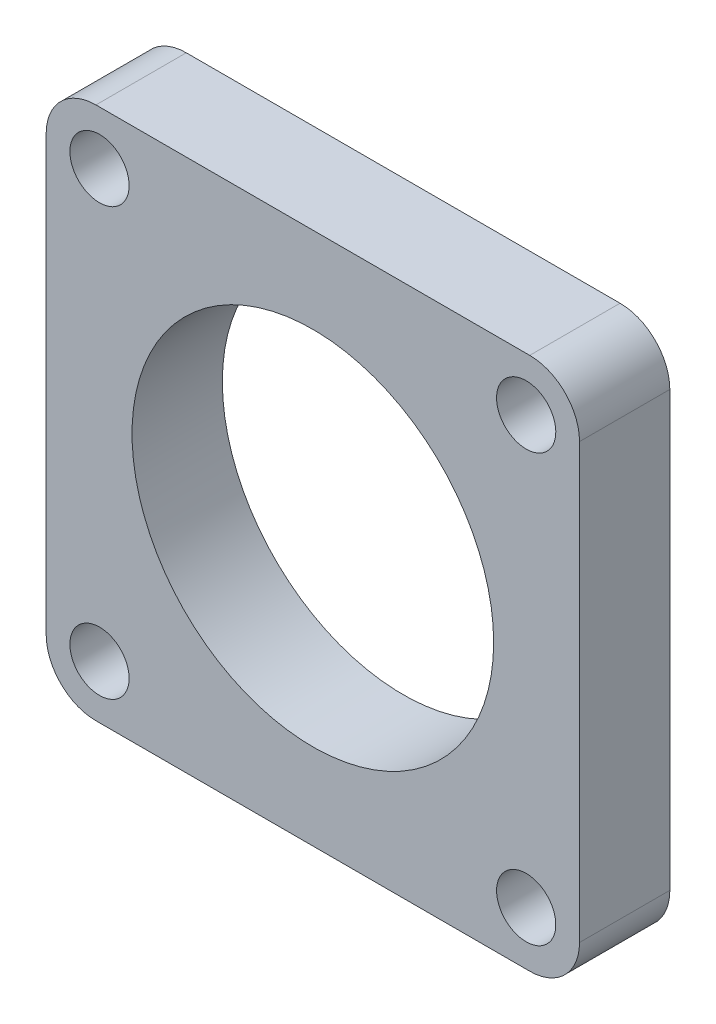
ISO-10303-21;
HEADER;
FILE_DESCRIPTION(('STEP AP214'),'2;1');
FILE_NAME('part.step','',(''),(''),'','','');
FILE_SCHEMA(('AUTOMOTIVE_DESIGN { 1 0 10303 214 1 1 1 1 }'));
ENDSEC;
DATA;
#1=APPLICATION_CONTEXT('core data for automotive mechanical design processes');
#2=APPLICATION_PROTOCOL_DEFINITION('international standard','automotive_design',2000,#1);
#3=PRODUCT_CONTEXT('',#1,'mechanical');
#4=PRODUCT('Part','Part','',(#3));
#5=PRODUCT_RELATED_PRODUCT_CATEGORY('part','',(#4));
#6=PRODUCT_DEFINITION_FORMATION('','',#4);
#7=PRODUCT_DEFINITION_CONTEXT('part definition',#1,'design');
#8=PRODUCT_DEFINITION('design','',#6,#7);
#9=PRODUCT_DEFINITION_SHAPE('','',#8);
#10=(LENGTH_UNIT() NAMED_UNIT(*) SI_UNIT(.MILLI.,.METRE.));
#11=(NAMED_UNIT(*) PLANE_ANGLE_UNIT() SI_UNIT($,.RADIAN.));
#12=(NAMED_UNIT(*) SI_UNIT($,.STERADIAN.) SOLID_ANGLE_UNIT());
#13=UNCERTAINTY_MEASURE_WITH_UNIT(LENGTH_MEASURE(1.E-05),#10,'distance_accuracy_value','');
#14=(GEOMETRIC_REPRESENTATION_CONTEXT(3) GLOBAL_UNCERTAINTY_ASSIGNED_CONTEXT((#13)) GLOBAL_UNIT_ASSIGNED_CONTEXT((#10,
#11,#12)) REPRESENTATION_CONTEXT('',''));
#15=CARTESIAN_POINT('',(0.,0.,0.));
#16=DIRECTION('',(0.,0.,1.));
#17=DIRECTION('',(1.,0.,0.));
#18=AXIS2_PLACEMENT_3D('',#15,#16,#17);
#19=CARTESIAN_POINT('',(37.5,-37.5,12.7));
#20=DIRECTION('',(-1.,0.,0.));
#21=DIRECTION('',(0.,0.,1.));
#22=AXIS2_PLACEMENT_3D('',#19,#20,#21);
#23=PLANE('',#22);
#24=DIRECTION('',(0.,1.,0.));
#25=VECTOR('',#24,1.);
#26=CARTESIAN_POINT('',(37.5,-37.5,12.7));
#27=LINE('',#26,#25);
#28=CARTESIAN_POINT('',(37.5,-30.5,12.7));
#29=VERTEX_POINT('',#28);
#30=CARTESIAN_POINT('',(37.5,30.5,12.7));
#31=VERTEX_POINT('',#30);
#32=EDGE_CURVE('E151',#29,#31,#27,.T.);
#33=ORIENTED_EDGE('',*,*,#32,.F.);
#34=DIRECTION('',(0.,0.,-1.));
#35=VECTOR('',#34,1.);
#36=CARTESIAN_POINT('',(37.5,-30.5,12.7));
#37=LINE('',#36,#35);
#38=CARTESIAN_POINT('',(37.5,-30.5,0.));
#39=VERTEX_POINT('',#38);
#40=EDGE_CURVE('E190',#29,#39,#37,.T.);
#41=ORIENTED_EDGE('',*,*,#40,.T.);
#42=DIRECTION('',(0.,1.,0.));
#43=VECTOR('',#42,1.);
#44=CARTESIAN_POINT('',(37.5,-37.5,0.));
#45=LINE('',#44,#43);
#46=CARTESIAN_POINT('',(37.5,30.5,0.));
#47=VERTEX_POINT('',#46);
#48=EDGE_CURVE('E201',#39,#47,#45,.T.);
#49=ORIENTED_EDGE('',*,*,#48,.T.);
#50=DIRECTION('',(0.,0.,-1.));
#51=VECTOR('',#50,1.);
#52=CARTESIAN_POINT('',(37.5,30.5,12.7));
#53=LINE('',#52,#51);
#54=EDGE_CURVE('E187',#47,#31,#53,.F.);
#55=ORIENTED_EDGE('',*,*,#54,.T.);
#56=EDGE_LOOP('',(#33,#41,#49,#55));
#57=FACE_BOUND('',#56,.T.);
#58=ADVANCED_FACE('F40',(#57),#23,.F.);
#59=CARTESIAN_POINT('',(-37.5,37.5,12.7));
#60=DIRECTION('',(0.,-1.,0.));
#61=DIRECTION('',(0.,0.,-1.));
#62=AXIS2_PLACEMENT_3D('',#59,#60,#61);
#63=PLANE('',#62);
#64=DIRECTION('',(-1.,0.,0.));
#65=VECTOR('',#64,1.);
#66=CARTESIAN_POINT('',(-37.5,37.5,0.));
#67=LINE('',#66,#65);
#68=CARTESIAN_POINT('',(30.5,37.5,0.));
#69=VERTEX_POINT('',#68);
#70=CARTESIAN_POINT('',(-30.5,37.5,0.));
#71=VERTEX_POINT('',#70);
#72=EDGE_CURVE('E159',#69,#71,#67,.T.);
#73=ORIENTED_EDGE('',*,*,#72,.T.);
#74=DIRECTION('',(0.,0.,-1.));
#75=VECTOR('',#74,1.);
#76=CARTESIAN_POINT('',(-30.5,37.5,12.7));
#77=LINE('',#76,#75);
#78=CARTESIAN_POINT('',(-30.5,37.5,12.7));
#79=VERTEX_POINT('',#78);
#80=EDGE_CURVE('E11',#71,#79,#77,.F.);
#81=ORIENTED_EDGE('',*,*,#80,.T.);
#82=DIRECTION('',(-1.,0.,0.));
#83=VECTOR('',#82,1.);
#84=CARTESIAN_POINT('',(-37.5,37.5,12.7));
#85=LINE('',#84,#83);
#86=CARTESIAN_POINT('',(30.5,37.5,12.7));
#87=VERTEX_POINT('',#86);
#88=EDGE_CURVE('E156',#87,#79,#85,.T.);
#89=ORIENTED_EDGE('',*,*,#88,.F.);
#90=DIRECTION('',(0.,0.,-1.));
#91=VECTOR('',#90,1.);
#92=CARTESIAN_POINT('',(30.5,37.5,12.7));
#93=LINE('',#92,#91);
#94=EDGE_CURVE('E49',#87,#69,#93,.T.);
#95=ORIENTED_EDGE('',*,*,#94,.T.);
#96=EDGE_LOOP('',(#73,#81,#89,#95));
#97=FACE_BOUND('',#96,.T.);
#98=ADVANCED_FACE('F197',(#97),#63,.F.);
#99=CARTESIAN_POINT('',(-37.5,-37.5,12.7));
#100=DIRECTION('',(1.,0.,0.));
#101=DIRECTION('',(0.,0.,-1.));
#102=AXIS2_PLACEMENT_3D('',#99,#100,#101);
#103=PLANE('',#102);
#104=DIRECTION('',(0.,-1.,0.));
#105=VECTOR('',#104,1.);
#106=CARTESIAN_POINT('',(-37.5,-37.5,0.));
#107=LINE('',#106,#105);
#108=CARTESIAN_POINT('',(-37.5,30.5,0.));
#109=VERTEX_POINT('',#108);
#110=CARTESIAN_POINT('',(-37.5,-30.5,0.));
#111=VERTEX_POINT('',#110);
#112=EDGE_CURVE('E152',#109,#111,#107,.T.);
#113=ORIENTED_EDGE('',*,*,#112,.T.);
#114=DIRECTION('',(0.,0.,-1.));
#115=VECTOR('',#114,1.);
#116=CARTESIAN_POINT('',(-37.5,-30.5,12.7));
#117=LINE('',#116,#115);
#118=CARTESIAN_POINT('',(-37.5,-30.5,12.7));
#119=VERTEX_POINT('',#118);
#120=EDGE_CURVE('E127',#111,#119,#117,.F.);
#121=ORIENTED_EDGE('',*,*,#120,.T.);
#122=DIRECTION('',(0.,-1.,0.));
#123=VECTOR('',#122,1.);
#124=CARTESIAN_POINT('',(-37.5,-37.5,12.7));
#125=LINE('',#124,#123);
#126=CARTESIAN_POINT('',(-37.5,30.5,12.7));
#127=VERTEX_POINT('',#126);
#128=EDGE_CURVE('E210',#127,#119,#125,.T.);
#129=ORIENTED_EDGE('',*,*,#128,.F.);
#130=DIRECTION('',(0.,0.,-1.));
#131=VECTOR('',#130,1.);
#132=CARTESIAN_POINT('',(-37.5,30.5,12.7));
#133=LINE('',#132,#131);
#134=EDGE_CURVE('E133',#127,#109,#133,.T.);
#135=ORIENTED_EDGE('',*,*,#134,.T.);
#136=EDGE_LOOP('',(#113,#121,#129,#135));
#137=FACE_BOUND('',#136,.T.);
#138=ADVANCED_FACE('F271',(#137),#103,.F.);
#139=CARTESIAN_POINT('',(-37.5,-37.5,12.7));
#140=DIRECTION('',(0.,1.,0.));
#141=DIRECTION('',(0.,0.,1.));
#142=AXIS2_PLACEMENT_3D('',#139,#140,#141);
#143=PLANE('',#142);
#144=DIRECTION('',(1.,0.,0.));
#145=VECTOR('',#144,1.);
#146=CARTESIAN_POINT('',(-37.5,-37.5,12.7));
#147=LINE('',#146,#145);
#148=CARTESIAN_POINT('',(-30.5,-37.5,12.7));
#149=VERTEX_POINT('',#148);
#150=CARTESIAN_POINT('',(30.5,-37.5,12.7));
#151=VERTEX_POINT('',#150);
#152=EDGE_CURVE('E143',#149,#151,#147,.T.);
#153=ORIENTED_EDGE('',*,*,#152,.F.);
#154=DIRECTION('',(0.,0.,-1.));
#155=VECTOR('',#154,1.);
#156=CARTESIAN_POINT('',(-30.5,-37.5,12.7));
#157=LINE('',#156,#155);
#158=CARTESIAN_POINT('',(-30.5,-37.5,0.));
#159=VERTEX_POINT('',#158);
#160=EDGE_CURVE('E126',#149,#159,#157,.T.);
#161=ORIENTED_EDGE('',*,*,#160,.T.);
#162=DIRECTION('',(1.,0.,0.));
#163=VECTOR('',#162,1.);
#164=CARTESIAN_POINT('',(-37.5,-37.5,0.));
#165=LINE('',#164,#163);
#166=CARTESIAN_POINT('',(30.5,-37.5,0.));
#167=VERTEX_POINT('',#166);
#168=EDGE_CURVE('E140',#159,#167,#165,.T.);
#169=ORIENTED_EDGE('',*,*,#168,.T.);
#170=DIRECTION('',(0.,0.,-1.));
#171=VECTOR('',#170,1.);
#172=CARTESIAN_POINT('',(30.5,-37.5,12.7));
#173=LINE('',#172,#171);
#174=EDGE_CURVE('E146',#167,#151,#173,.F.);
#175=ORIENTED_EDGE('',*,*,#174,.T.);
#176=EDGE_LOOP('',(#153,#161,#169,#175));
#177=FACE_BOUND('',#176,.T.);
#178=ADVANCED_FACE('F139',(#177),#143,.F.);
#179=CARTESIAN_POINT('',(0.,0.,12.7));
#180=DIRECTION('',(0.,0.,-1.));
#181=DIRECTION('',(-1.,0.,0.));
#182=AXIS2_PLACEMENT_3D('',#179,#180,#181);
#183=PLANE('',#182);
#184=CARTESIAN_POINT('',(30.0000000000001,29.9999999999999,12.7));
#185=DIRECTION('',(0.,0.,1.));
#186=DIRECTION('',(0.,-1.,0.));
#187=AXIS2_PLACEMENT_3D('',#184,#185,#186);
#188=CIRCLE('',#187,4.165);
#189=CARTESIAN_POINT('',(30.0000000000001,25.8349999999999,12.7));
#190=VERTEX_POINT('',#189);
#191=EDGE_CURVE('E227',#190,#190,#188,.T.);
#192=ORIENTED_EDGE('',*,*,#191,.F.);
#193=EDGE_LOOP('',(#192));
#194=FACE_BOUND('',#193,.T.);
#195=CARTESIAN_POINT('',(30.,-30.,12.7));
#196=DIRECTION('',(0.,0.,1.));
#197=DIRECTION('',(-1.,0.,0.));
#198=AXIS2_PLACEMENT_3D('',#195,#196,#197);
#199=CIRCLE('',#198,4.165);
#200=CARTESIAN_POINT('',(25.835,-30.,12.7));
#201=VERTEX_POINT('',#200);
#202=EDGE_CURVE('E243',#201,#201,#199,.T.);
#203=ORIENTED_EDGE('',*,*,#202,.F.);
#204=EDGE_LOOP('',(#203));
#205=FACE_BOUND('',#204,.T.);
#206=CARTESIAN_POINT('',(-30.0000000000003,-29.9999999999997,12.7));
#207=DIRECTION('',(0.,0.,1.));
#208=DIRECTION('',(0.,1.,0.));
#209=AXIS2_PLACEMENT_3D('',#206,#207,#208);
#210=CIRCLE('',#209,4.165);
#211=CARTESIAN_POINT('',(-30.0000000000003,-25.8349999999997,12.7));
#212=VERTEX_POINT('',#211);
#213=EDGE_CURVE('E235',#212,#212,#210,.T.);
#214=ORIENTED_EDGE('',*,*,#213,.F.);
#215=EDGE_LOOP('',(#214));
#216=FACE_BOUND('',#215,.T.);
#217=CARTESIAN_POINT('',(-30.,30.,12.7));
#218=DIRECTION('',(0.,0.,1.));
#219=DIRECTION('',(1.,0.,0.));
#220=AXIS2_PLACEMENT_3D('',#217,#218,#219);
#221=CIRCLE('',#220,4.165);
#222=CARTESIAN_POINT('',(-25.835,30.,12.7));
#223=VERTEX_POINT('',#222);
#224=EDGE_CURVE('E219',#223,#223,#221,.T.);
#225=ORIENTED_EDGE('',*,*,#224,.F.);
#226=EDGE_LOOP('',(#225));
#227=FACE_BOUND('',#226,.T.);
#228=CARTESIAN_POINT('',(0.,0.,12.7));
#229=DIRECTION('',(0.,0.,1.));
#230=DIRECTION('',(1.,0.,0.));
#231=AXIS2_PLACEMENT_3D('',#228,#229,#230);
#232=CIRCLE('',#231,25.4254);
#233=CARTESIAN_POINT('',(25.4254,0.,12.7));
#234=VERTEX_POINT('',#233);
#235=EDGE_CURVE('E205',#234,#234,#232,.T.);
#236=ORIENTED_EDGE('',*,*,#235,.F.);
#237=EDGE_LOOP('',(#236));
#238=FACE_BOUND('',#237,.T.);
#239=ORIENTED_EDGE('',*,*,#128,.T.);
#240=CARTESIAN_POINT('',(-30.5,-30.5,12.7));
#241=DIRECTION('',(0.,0.,-1.));
#242=DIRECTION('',(-1.,0.,0.));
#243=AXIS2_PLACEMENT_3D('',#240,#241,#242);
#244=CIRCLE('',#243,7.);
#245=EDGE_CURVE('E184',#119,#149,#244,.F.);
#246=ORIENTED_EDGE('',*,*,#245,.T.);
#247=ORIENTED_EDGE('',*,*,#152,.T.);
#248=CARTESIAN_POINT('',(30.5,-30.5,12.7));
#249=DIRECTION('',(0.,0.,-1.));
#250=DIRECTION('',(-1.,0.,0.));
#251=AXIS2_PLACEMENT_3D('',#248,#249,#250);
#252=CIRCLE('',#251,7.);
#253=EDGE_CURVE('E181',#151,#29,#252,.F.);
#254=ORIENTED_EDGE('',*,*,#253,.T.);
#255=ORIENTED_EDGE('',*,*,#32,.T.);
#256=CARTESIAN_POINT('',(30.5,30.5,12.7));
#257=DIRECTION('',(0.,0.,-1.));
#258=DIRECTION('',(-1.,0.,0.));
#259=AXIS2_PLACEMENT_3D('',#256,#257,#258);
#260=CIRCLE('',#259,7.);
#261=EDGE_CURVE('E66',#31,#87,#260,.F.);
#262=ORIENTED_EDGE('',*,*,#261,.T.);
#263=ORIENTED_EDGE('',*,*,#88,.T.);
#264=CARTESIAN_POINT('',(-30.5,30.5,12.7));
#265=DIRECTION('',(0.,0.,-1.));
#266=DIRECTION('',(-1.,0.,0.));
#267=AXIS2_PLACEMENT_3D('',#264,#265,#266);
#268=CIRCLE('',#267,7.);
#269=EDGE_CURVE('E179',#79,#127,#268,.F.);
#270=ORIENTED_EDGE('',*,*,#269,.T.);
#271=EDGE_LOOP('',(#239,#246,#247,#254,#255,#262,#263,#270));
#272=FACE_BOUND('',#271,.T.);
#273=ADVANCED_FACE('F256',(#194,#205,#216,#227,#238,#272),#183,.F.);
#274=CARTESIAN_POINT('',(0.,0.,0.));
#275=DIRECTION('',(0.,0.,-1.));
#276=DIRECTION('',(-1.,0.,0.));
#277=AXIS2_PLACEMENT_3D('',#274,#275,#276);
#278=PLANE('',#277);
#279=CARTESIAN_POINT('',(30.0000000000001,29.9999999999999,0.));
#280=DIRECTION('',(0.,0.,-1.));
#281=DIRECTION('',(-1.,0.,0.));
#282=AXIS2_PLACEMENT_3D('',#279,#280,#281);
#283=CIRCLE('',#282,4.165);
#284=CARTESIAN_POINT('',(25.8350000000001,29.9999999999999,0.));
#285=VERTEX_POINT('',#284);
#286=EDGE_CURVE('E247',#285,#285,#283,.F.);
#287=ORIENTED_EDGE('',*,*,#286,.T.);
#288=EDGE_LOOP('',(#287));
#289=FACE_BOUND('',#288,.T.);
#290=CARTESIAN_POINT('',(30.,-30.,0.));
#291=DIRECTION('',(0.,0.,-1.));
#292=DIRECTION('',(-1.,0.,0.));
#293=AXIS2_PLACEMENT_3D('',#290,#291,#292);
#294=CIRCLE('',#293,4.165);
#295=CARTESIAN_POINT('',(25.835,-30.,0.));
#296=VERTEX_POINT('',#295);
#297=EDGE_CURVE('E239',#296,#296,#294,.F.);
#298=ORIENTED_EDGE('',*,*,#297,.T.);
#299=EDGE_LOOP('',(#298));
#300=FACE_BOUND('',#299,.T.);
#301=CARTESIAN_POINT('',(-30.0000000000003,-29.9999999999997,0.));
#302=DIRECTION('',(0.,0.,-1.));
#303=DIRECTION('',(-1.,0.,0.));
#304=AXIS2_PLACEMENT_3D('',#301,#302,#303);
#305=CIRCLE('',#304,4.165);
#306=CARTESIAN_POINT('',(-34.1650000000003,-29.9999999999997,0.));
#307=VERTEX_POINT('',#306);
#308=EDGE_CURVE('E231',#307,#307,#305,.F.);
#309=ORIENTED_EDGE('',*,*,#308,.T.);
#310=EDGE_LOOP('',(#309));
#311=FACE_BOUND('',#310,.T.);
#312=CARTESIAN_POINT('',(-30.,30.,0.));
#313=DIRECTION('',(0.,0.,-1.));
#314=DIRECTION('',(-1.,0.,0.));
#315=AXIS2_PLACEMENT_3D('',#312,#313,#314);
#316=CIRCLE('',#315,4.165);
#317=CARTESIAN_POINT('',(-34.165,30.,0.));
#318=VERTEX_POINT('',#317);
#319=EDGE_CURVE('E223',#318,#318,#316,.F.);
#320=ORIENTED_EDGE('',*,*,#319,.T.);
#321=EDGE_LOOP('',(#320));
#322=FACE_BOUND('',#321,.T.);
#323=CARTESIAN_POINT('',(0.,0.,0.));
#324=DIRECTION('',(0.,0.,-1.));
#325=DIRECTION('',(-1.,0.,0.));
#326=AXIS2_PLACEMENT_3D('',#323,#324,#325);
#327=CIRCLE('',#326,25.4254);
#328=CARTESIAN_POINT('',(-25.4254,0.,0.));
#329=VERTEX_POINT('',#328);
#330=EDGE_CURVE('E215',#329,#329,#327,.F.);
#331=ORIENTED_EDGE('',*,*,#330,.T.);
#332=EDGE_LOOP('',(#331));
#333=FACE_BOUND('',#332,.T.);
#334=ORIENTED_EDGE('',*,*,#168,.F.);
#335=CARTESIAN_POINT('',(-30.5,-30.5,0.));
#336=DIRECTION('',(0.,0.,-1.));
#337=DIRECTION('',(-1.,0.,0.));
#338=AXIS2_PLACEMENT_3D('',#335,#336,#337);
#339=CIRCLE('',#338,7.);
#340=EDGE_CURVE('E122',#159,#111,#339,.T.);
#341=ORIENTED_EDGE('',*,*,#340,.T.);
#342=ORIENTED_EDGE('',*,*,#112,.F.);
#343=CARTESIAN_POINT('',(-30.5,30.5,0.));
#344=DIRECTION('',(0.,0.,-1.));
#345=DIRECTION('',(-1.,0.,0.));
#346=AXIS2_PLACEMENT_3D('',#343,#344,#345);
#347=CIRCLE('',#346,7.);
#348=EDGE_CURVE('E167',#109,#71,#347,.T.);
#349=ORIENTED_EDGE('',*,*,#348,.T.);
#350=ORIENTED_EDGE('',*,*,#72,.F.);
#351=CARTESIAN_POINT('',(30.5,30.5,0.));
#352=DIRECTION('',(0.,0.,-1.));
#353=DIRECTION('',(-1.,0.,0.));
#354=AXIS2_PLACEMENT_3D('',#351,#352,#353);
#355=CIRCLE('',#354,7.);
#356=EDGE_CURVE('E145',#69,#47,#355,.T.);
#357=ORIENTED_EDGE('',*,*,#356,.T.);
#358=ORIENTED_EDGE('',*,*,#48,.F.);
#359=CARTESIAN_POINT('',(30.5,-30.5,0.));
#360=DIRECTION('',(0.,0.,-1.));
#361=DIRECTION('',(-1.,0.,0.));
#362=AXIS2_PLACEMENT_3D('',#359,#360,#361);
#363=CIRCLE('',#362,7.);
#364=EDGE_CURVE('E134',#39,#167,#363,.T.);
#365=ORIENTED_EDGE('',*,*,#364,.T.);
#366=EDGE_LOOP('',(#334,#341,#342,#349,#350,#357,#358,#365));
#367=FACE_BOUND('',#366,.T.);
#368=ADVANCED_FACE('F148',(#289,#300,#311,#322,#333,#367),#278,.T.);
#369=CARTESIAN_POINT('',(-30.5,-30.5,12.7));
#370=DIRECTION('',(0.,0.,-1.));
#371=DIRECTION('',(-1.,0.,0.));
#372=AXIS2_PLACEMENT_3D('',#369,#370,#371);
#373=CYLINDRICAL_SURFACE('',#372,7.);
#374=ORIENTED_EDGE('',*,*,#245,.F.);
#375=ORIENTED_EDGE('',*,*,#120,.F.);
#376=ORIENTED_EDGE('',*,*,#340,.F.);
#377=ORIENTED_EDGE('',*,*,#160,.F.);
#378=EDGE_LOOP('',(#374,#375,#376,#377));
#379=FACE_BOUND('',#378,.T.);
#380=ADVANCED_FACE('F125',(#379),#373,.T.);
#381=CARTESIAN_POINT('',(30.5,-30.5,12.7));
#382=DIRECTION('',(0.,0.,-1.));
#383=DIRECTION('',(-1.,0.,0.));
#384=AXIS2_PLACEMENT_3D('',#381,#382,#383);
#385=CYLINDRICAL_SURFACE('',#384,7.);
#386=ORIENTED_EDGE('',*,*,#253,.F.);
#387=ORIENTED_EDGE('',*,*,#174,.F.);
#388=ORIENTED_EDGE('',*,*,#364,.F.);
#389=ORIENTED_EDGE('',*,*,#40,.F.);
#390=EDGE_LOOP('',(#386,#387,#388,#389));
#391=FACE_BOUND('',#390,.T.);
#392=ADVANCED_FACE('F275',(#391),#385,.T.);
#393=CARTESIAN_POINT('',(-30.5,30.5,12.7));
#394=DIRECTION('',(0.,0.,-1.));
#395=DIRECTION('',(-1.,0.,0.));
#396=AXIS2_PLACEMENT_3D('',#393,#394,#395);
#397=CYLINDRICAL_SURFACE('',#396,7.);
#398=ORIENTED_EDGE('',*,*,#269,.F.);
#399=ORIENTED_EDGE('',*,*,#80,.F.);
#400=ORIENTED_EDGE('',*,*,#348,.F.);
#401=ORIENTED_EDGE('',*,*,#134,.F.);
#402=EDGE_LOOP('',(#398,#399,#400,#401));
#403=FACE_BOUND('',#402,.T.);
#404=ADVANCED_FACE('F273',(#403),#397,.T.);
#405=CARTESIAN_POINT('',(30.5,30.5,12.7));
#406=DIRECTION('',(0.,0.,-1.));
#407=DIRECTION('',(-1.,0.,0.));
#408=AXIS2_PLACEMENT_3D('',#405,#406,#407);
#409=CYLINDRICAL_SURFACE('',#408,7.);
#410=ORIENTED_EDGE('',*,*,#261,.F.);
#411=ORIENTED_EDGE('',*,*,#54,.F.);
#412=ORIENTED_EDGE('',*,*,#356,.F.);
#413=ORIENTED_EDGE('',*,*,#94,.F.);
#414=EDGE_LOOP('',(#410,#411,#412,#413));
#415=FACE_BOUND('',#414,.T.);
#416=ADVANCED_FACE('F42',(#415),#409,.T.);
#417=CARTESIAN_POINT('',(0.,0.,-0.000999999999999265));
#418=DIRECTION('',(0.,0.,1.));
#419=DIRECTION('',(1.,0.,0.));
#420=AXIS2_PLACEMENT_3D('',#417,#418,#419);
#421=CYLINDRICAL_SURFACE('',#420,25.4254);
#422=ORIENTED_EDGE('',*,*,#330,.F.);
#423=EDGE_LOOP('',(#422));
#424=FACE_BOUND('',#423,.T.);
#425=ORIENTED_EDGE('',*,*,#235,.T.);
#426=EDGE_LOOP('',(#425));
#427=FACE_BOUND('',#426,.T.);
#428=ADVANCED_FACE('F280',(#424,#427),#421,.F.);
#429=CARTESIAN_POINT('',(-30.,30.,-0.000999999999999265));
#430=DIRECTION('',(0.,0.,1.));
#431=DIRECTION('',(1.,0.,0.));
#432=AXIS2_PLACEMENT_3D('',#429,#430,#431);
#433=CYLINDRICAL_SURFACE('',#432,4.165);
#434=ORIENTED_EDGE('',*,*,#319,.F.);
#435=EDGE_LOOP('',(#434));
#436=FACE_BOUND('',#435,.T.);
#437=ORIENTED_EDGE('',*,*,#224,.T.);
#438=EDGE_LOOP('',(#437));
#439=FACE_BOUND('',#438,.T.);
#440=ADVANCED_FACE('F325',(#436,#439),#433,.F.);
#441=CARTESIAN_POINT('',(-30.0000000000003,-29.9999999999997,-0.000999999999999265));
#442=DIRECTION('',(0.,0.,1.));
#443=DIRECTION('',(1.,0.,0.));
#444=AXIS2_PLACEMENT_3D('',#441,#442,#443);
#445=CYLINDRICAL_SURFACE('',#444,4.165);
#446=ORIENTED_EDGE('',*,*,#308,.F.);
#447=EDGE_LOOP('',(#446));
#448=FACE_BOUND('',#447,.T.);
#449=ORIENTED_EDGE('',*,*,#213,.T.);
#450=EDGE_LOOP('',(#449));
#451=FACE_BOUND('',#450,.T.);
#452=ADVANCED_FACE('F379',(#448,#451),#445,.F.);
#453=CARTESIAN_POINT('',(30.,-30.,-0.000999999999999265));
#454=DIRECTION('',(0.,0.,1.));
#455=DIRECTION('',(1.,0.,0.));
#456=AXIS2_PLACEMENT_3D('',#453,#454,#455);
#457=CYLINDRICAL_SURFACE('',#456,4.165);
#458=ORIENTED_EDGE('',*,*,#297,.F.);
#459=EDGE_LOOP('',(#458));
#460=FACE_BOUND('',#459,.T.);
#461=ORIENTED_EDGE('',*,*,#202,.T.);
#462=EDGE_LOOP('',(#461));
#463=FACE_BOUND('',#462,.T.);
#464=ADVANCED_FACE('F388',(#460,#463),#457,.F.);
#465=CARTESIAN_POINT('',(30.0000000000001,29.9999999999999,-0.000999999999999265));
#466=DIRECTION('',(0.,0.,1.));
#467=DIRECTION('',(1.,0.,0.));
#468=AXIS2_PLACEMENT_3D('',#465,#466,#467);
#469=CYLINDRICAL_SURFACE('',#468,4.165);
#470=ORIENTED_EDGE('',*,*,#286,.F.);
#471=EDGE_LOOP('',(#470));
#472=FACE_BOUND('',#471,.T.);
#473=ORIENTED_EDGE('',*,*,#191,.T.);
#474=EDGE_LOOP('',(#473));
#475=FACE_BOUND('',#474,.T.);
#476=ADVANCED_FACE('F254',(#472,#475),#469,.F.);
#477=CLOSED_SHELL('',(#58,#98,#138,#178,#273,#368,#380,#392,#404,#416,#428,#440,#452,#464,#476));
#478=MANIFOLD_SOLID_BREP('B2',#477);
#479=ADVANCED_BREP_SHAPE_REPRESENTATION('',(#18,#478),#14);
#480=SHAPE_DEFINITION_REPRESENTATION(#9,#479);
ENDSEC;
END-ISO-10303-21;
